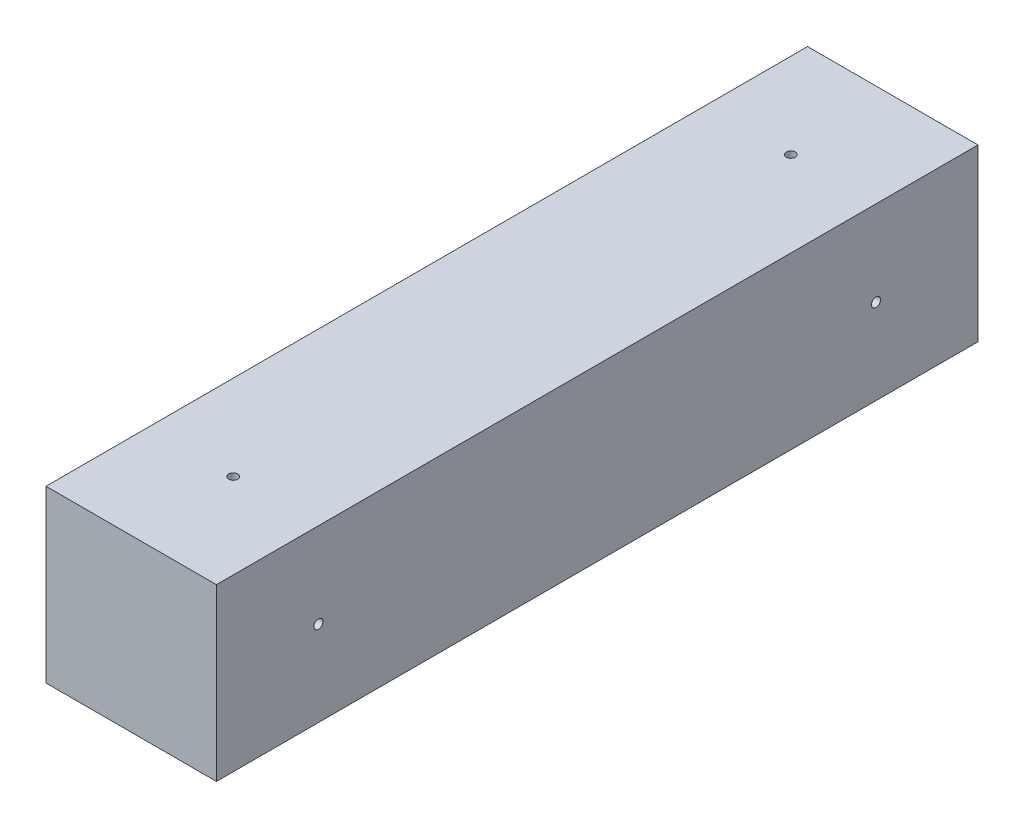
ISO-10303-21;
HEADER;
FILE_DESCRIPTION(('STEP AP214'),'2;1');
FILE_NAME('part.step','',(''),(''),'','','');
FILE_SCHEMA(('AUTOMOTIVE_DESIGN { 1 0 10303 214 1 1 1 1 }'));
ENDSEC;
DATA;
#1=APPLICATION_CONTEXT('core data for automotive mechanical design processes');
#2=APPLICATION_PROTOCOL_DEFINITION('international standard','automotive_design',2000,#1);
#3=PRODUCT_CONTEXT('',#1,'mechanical');
#4=PRODUCT('Part','Part','',(#3));
#5=PRODUCT_RELATED_PRODUCT_CATEGORY('part','',(#4));
#6=PRODUCT_DEFINITION_FORMATION('','',#4);
#7=PRODUCT_DEFINITION_CONTEXT('part definition',#1,'design');
#8=PRODUCT_DEFINITION('design','',#6,#7);
#9=PRODUCT_DEFINITION_SHAPE('','',#8);
#10=(LENGTH_UNIT() NAMED_UNIT(*) SI_UNIT(.MILLI.,.METRE.));
#11=(NAMED_UNIT(*) PLANE_ANGLE_UNIT() SI_UNIT($,.RADIAN.));
#12=(NAMED_UNIT(*) SI_UNIT($,.STERADIAN.) SOLID_ANGLE_UNIT());
#13=UNCERTAINTY_MEASURE_WITH_UNIT(LENGTH_MEASURE(1.E-05),#10,'distance_accuracy_value','');
#14=(GEOMETRIC_REPRESENTATION_CONTEXT(3) GLOBAL_UNCERTAINTY_ASSIGNED_CONTEXT((#13)) GLOBAL_UNIT_ASSIGNED_CONTEXT((#10,
#11,#12)) REPRESENTATION_CONTEXT('',''));
#15=CARTESIAN_POINT('',(0.,0.,0.));
#16=DIRECTION('',(0.,0.,1.));
#17=DIRECTION('',(1.,0.,0.));
#18=AXIS2_PLACEMENT_3D('',#15,#16,#17);
#19=CARTESIAN_POINT('',(25.4,0.,83.0999999999998));
#20=DIRECTION('',(1.,0.,0.));
#21=DIRECTION('',(0.,0.,-1.));
#22=AXIS2_PLACEMENT_3D('',#19,#20,#21);
#23=CYLINDRICAL_SURFACE('',#22,1.35254999999999);
#24=CARTESIAN_POINT('',(25.4,0.,83.0999999999998));
#25=DIRECTION('',(1.,0.,0.));
#26=DIRECTION('',(0.,0.,-1.));
#27=AXIS2_PLACEMENT_3D('',#24,#25,#26);
#28=CIRCLE('',#27,1.35254999999999);
#29=CARTESIAN_POINT('',(25.4,0.,81.7474499999998));
#30=VERTEX_POINT('',#29);
#31=EDGE_CURVE('E146',#30,#30,#28,.T.);
#32=ORIENTED_EDGE('',*,*,#31,.T.);
#33=EDGE_LOOP('',(#32));
#34=FACE_BOUND('',#33,.T.);
#35=CARTESIAN_POINT('',(-2.53269627492614E-13,0.,83.099999999999));
#36=DIRECTION('',(0.707106781186547,-0.707106781186547,0.));
#37=DIRECTION('',(0.707106781186547,0.707106781186547,0.));
#38=AXIS2_PLACEMENT_3D('',#35,#36,#37);
#39=ELLIPSE('',#38,1.91279455378772,1.35254999999999);
#40=CARTESIAN_POINT('',(-2.53269627492614E-13,0.,84.452549999999));
#41=VERTEX_POINT('',#40);
#42=CARTESIAN_POINT('',(-2.53269627492614E-13,0.,81.747449999999));
#43=VERTEX_POINT('',#42);
#44=EDGE_CURVE('E46',#41,#43,#39,.F.);
#45=ORIENTED_EDGE('',*,*,#44,.T.);
#46=CARTESIAN_POINT('',(-2.53269627492614E-13,0.,83.099999999999));
#47=DIRECTION('',(0.707106781186547,0.707106781186547,0.));
#48=DIRECTION('',(0.707106781186547,-0.707106781186547,0.));
#49=AXIS2_PLACEMENT_3D('',#46,#47,#48);
#50=ELLIPSE('',#49,1.91279455378772,1.35254999999999);
#51=EDGE_CURVE('E11',#43,#41,#50,.F.);
#52=ORIENTED_EDGE('',*,*,#51,.T.);
#53=EDGE_LOOP('',(#45,#52));
#54=FACE_BOUND('',#53,.T.);
#55=ADVANCED_FACE('F33',(#34,#54),#23,.F.);
#56=CARTESIAN_POINT('',(25.4,0.,-83.0999999999999));
#57=DIRECTION('',(1.,0.,0.));
#58=DIRECTION('',(0.,0.,-1.));
#59=AXIS2_PLACEMENT_3D('',#56,#57,#58);
#60=CYLINDRICAL_SURFACE('',#59,1.35254999999999);
#61=CARTESIAN_POINT('',(25.4,0.,-83.0999999999999));
#62=DIRECTION('',(1.,0.,0.));
#63=DIRECTION('',(0.,0.,-1.));
#64=AXIS2_PLACEMENT_3D('',#61,#62,#63);
#65=CIRCLE('',#64,1.35254999999999);
#66=CARTESIAN_POINT('',(25.4,0.,-84.4525499999999));
#67=VERTEX_POINT('',#66);
#68=EDGE_CURVE('E140',#67,#67,#65,.T.);
#69=ORIENTED_EDGE('',*,*,#68,.T.);
#70=EDGE_LOOP('',(#69));
#71=FACE_BOUND('',#70,.T.);
#72=CARTESIAN_POINT('',(-2.53269627492614E-13,0.,-83.1000000000009));
#73=DIRECTION('',(0.707106781186547,-0.707106781186547,0.));
#74=DIRECTION('',(0.707106781186547,0.707106781186547,0.));
#75=AXIS2_PLACEMENT_3D('',#72,#73,#74);
#76=ELLIPSE('',#75,1.91279455378772,1.35254999999999);
#77=CARTESIAN_POINT('',(-2.53269627492614E-13,0.,-81.7474500000009));
#78=VERTEX_POINT('',#77);
#79=CARTESIAN_POINT('',(-2.53269627492614E-13,0.,-84.4525500000009));
#80=VERTEX_POINT('',#79);
#81=EDGE_CURVE('E53',#78,#80,#76,.F.);
#82=ORIENTED_EDGE('',*,*,#81,.T.);
#83=CARTESIAN_POINT('',(-2.53269627492614E-13,0.,-83.1000000000009));
#84=DIRECTION('',(0.707106781186547,0.707106781186547,0.));
#85=DIRECTION('',(0.707106781186547,-0.707106781186547,0.));
#86=AXIS2_PLACEMENT_3D('',#83,#84,#85);
#87=ELLIPSE('',#86,1.91279455378772,1.35254999999999);
#88=EDGE_CURVE('E94',#80,#78,#87,.F.);
#89=ORIENTED_EDGE('',*,*,#88,.T.);
#90=EDGE_LOOP('',(#82,#89));
#91=FACE_BOUND('',#90,.T.);
#92=ADVANCED_FACE('F198',(#71,#91),#60,.F.);
#93=CARTESIAN_POINT('',(-25.4,25.4,113.5));
#94=DIRECTION('',(1.,0.,0.));
#95=DIRECTION('',(0.,1.,0.));
#96=AXIS2_PLACEMENT_3D('',#93,#94,#95);
#97=PLANE('',#96);
#98=CARTESIAN_POINT('',(-25.4,0.,83.0999999999998));
#99=DIRECTION('',(1.,0.,0.));
#100=DIRECTION('',(0.,0.,-1.));
#101=AXIS2_PLACEMENT_3D('',#98,#99,#100);
#102=CIRCLE('',#101,1.35254999999999);
#103=CARTESIAN_POINT('',(-25.4,0.,81.7474499999998));
#104=VERTEX_POINT('',#103);
#105=EDGE_CURVE('E143',#104,#104,#102,.T.);
#106=ORIENTED_EDGE('',*,*,#105,.T.);
#107=EDGE_LOOP('',(#106));
#108=FACE_BOUND('',#107,.T.);
#109=CARTESIAN_POINT('',(-25.4,0.,-83.0999999999999));
#110=DIRECTION('',(1.,0.,0.));
#111=DIRECTION('',(0.,0.,-1.));
#112=AXIS2_PLACEMENT_3D('',#109,#110,#111);
#113=CIRCLE('',#112,1.35254999999999);
#114=CARTESIAN_POINT('',(-25.4,0.,-84.4525499999999));
#115=VERTEX_POINT('',#114);
#116=EDGE_CURVE('E130',#115,#115,#113,.T.);
#117=ORIENTED_EDGE('',*,*,#116,.T.);
#118=EDGE_LOOP('',(#117));
#119=FACE_BOUND('',#118,.T.);
#120=DIRECTION('',(0.,-1.,0.));
#121=VECTOR('',#120,1.);
#122=CARTESIAN_POINT('',(-25.4,25.4,-113.5));
#123=LINE('',#122,#121);
#124=CARTESIAN_POINT('',(-25.4,25.4,-113.5));
#125=VERTEX_POINT('',#124);
#126=CARTESIAN_POINT('',(-25.4,-25.4,-113.5));
#127=VERTEX_POINT('',#126);
#128=EDGE_CURVE('E127',#125,#127,#123,.T.);
#129=ORIENTED_EDGE('',*,*,#128,.T.);
#130=DIRECTION('',(0.,0.,-1.));
#131=VECTOR('',#130,1.);
#132=CARTESIAN_POINT('',(-25.4,-25.4,113.5));
#133=LINE('',#132,#131);
#134=CARTESIAN_POINT('',(-25.4,-25.4,113.5));
#135=VERTEX_POINT('',#134);
#136=EDGE_CURVE('E107',#135,#127,#133,.T.);
#137=ORIENTED_EDGE('',*,*,#136,.F.);
#138=DIRECTION('',(0.,-1.,0.));
#139=VECTOR('',#138,1.);
#140=CARTESIAN_POINT('',(-25.4,25.4,113.5));
#141=LINE('',#140,#139);
#142=CARTESIAN_POINT('',(-25.4,25.4,113.5));
#143=VERTEX_POINT('',#142);
#144=EDGE_CURVE('E122',#143,#135,#141,.T.);
#145=ORIENTED_EDGE('',*,*,#144,.F.);
#146=DIRECTION('',(0.,0.,-1.));
#147=VECTOR('',#146,1.);
#148=CARTESIAN_POINT('',(-25.4,25.4,113.5));
#149=LINE('',#148,#147);
#150=EDGE_CURVE('E116',#143,#125,#149,.T.);
#151=ORIENTED_EDGE('',*,*,#150,.T.);
#152=EDGE_LOOP('',(#129,#137,#145,#151));
#153=FACE_BOUND('',#152,.T.);
#154=ADVANCED_FACE('F35',(#108,#119,#153),#97,.F.);
#155=CARTESIAN_POINT('',(-25.4,-25.4,113.5));
#156=DIRECTION('',(0.,1.,0.));
#157=DIRECTION('',(0.,0.,1.));
#158=AXIS2_PLACEMENT_3D('',#155,#156,#157);
#159=PLANE('',#158);
#160=CARTESIAN_POINT('',(-2.53269627492614E-13,-25.4,83.0999999999981));
#161=DIRECTION('',(0.,1.,0.));
#162=DIRECTION('',(0.,0.,1.));
#163=AXIS2_PLACEMENT_3D('',#160,#161,#162);
#164=CIRCLE('',#163,1.35254999999999);
#165=CARTESIAN_POINT('',(-2.53269627492614E-13,-25.4,84.4525499999981));
#166=VERTEX_POINT('',#165);
#167=EDGE_CURVE('E155',#166,#166,#164,.T.);
#168=ORIENTED_EDGE('',*,*,#167,.T.);
#169=EDGE_LOOP('',(#168));
#170=FACE_BOUND('',#169,.T.);
#171=CARTESIAN_POINT('',(-2.53269627492614E-13,-25.4,-83.1000000000019));
#172=DIRECTION('',(0.,1.,0.));
#173=DIRECTION('',(0.,0.,1.));
#174=AXIS2_PLACEMENT_3D('',#171,#172,#173);
#175=CIRCLE('',#174,1.35254999999999);
#176=CARTESIAN_POINT('',(-2.53269627492614E-13,-25.4,-81.7474500000019));
#177=VERTEX_POINT('',#176);
#178=EDGE_CURVE('E149',#177,#177,#175,.T.);
#179=ORIENTED_EDGE('',*,*,#178,.T.);
#180=EDGE_LOOP('',(#179));
#181=FACE_BOUND('',#180,.T.);
#182=DIRECTION('',(1.,0.,0.));
#183=VECTOR('',#182,1.);
#184=CARTESIAN_POINT('',(-25.4,-25.4,-113.5));
#185=LINE('',#184,#183);
#186=CARTESIAN_POINT('',(25.4,-25.4,-113.5));
#187=VERTEX_POINT('',#186);
#188=EDGE_CURVE('E125',#127,#187,#185,.T.);
#189=ORIENTED_EDGE('',*,*,#188,.T.);
#190=DIRECTION('',(0.,0.,-1.));
#191=VECTOR('',#190,1.);
#192=CARTESIAN_POINT('',(25.4,-25.4,113.5));
#193=LINE('',#192,#191);
#194=CARTESIAN_POINT('',(25.4,-25.4,113.5));
#195=VERTEX_POINT('',#194);
#196=EDGE_CURVE('E110',#195,#187,#193,.T.);
#197=ORIENTED_EDGE('',*,*,#196,.F.);
#198=DIRECTION('',(1.,0.,0.));
#199=VECTOR('',#198,1.);
#200=CARTESIAN_POINT('',(-25.4,-25.4,113.5));
#201=LINE('',#200,#199);
#202=EDGE_CURVE('E134',#135,#195,#201,.T.);
#203=ORIENTED_EDGE('',*,*,#202,.F.);
#204=ORIENTED_EDGE('',*,*,#136,.T.);
#205=EDGE_LOOP('',(#189,#197,#203,#204));
#206=FACE_BOUND('',#205,.T.);
#207=ADVANCED_FACE('F184',(#170,#181,#206),#159,.F.);
#208=CARTESIAN_POINT('',(25.4,25.4,113.5));
#209=DIRECTION('',(-1.,0.,0.));
#210=DIRECTION('',(0.,-1.,0.));
#211=AXIS2_PLACEMENT_3D('',#208,#209,#210);
#212=PLANE('',#211);
#213=ORIENTED_EDGE('',*,*,#31,.F.);
#214=EDGE_LOOP('',(#213));
#215=FACE_BOUND('',#214,.T.);
#216=ORIENTED_EDGE('',*,*,#68,.F.);
#217=EDGE_LOOP('',(#216));
#218=FACE_BOUND('',#217,.T.);
#219=DIRECTION('',(0.,1.,0.));
#220=VECTOR('',#219,1.);
#221=CARTESIAN_POINT('',(25.4,25.4,-113.5));
#222=LINE('',#221,#220);
#223=CARTESIAN_POINT('',(25.4,25.4,-113.5));
#224=VERTEX_POINT('',#223);
#225=EDGE_CURVE('E123',#187,#224,#222,.T.);
#226=ORIENTED_EDGE('',*,*,#225,.T.);
#227=DIRECTION('',(0.,0.,-1.));
#228=VECTOR('',#227,1.);
#229=CARTESIAN_POINT('',(25.4,25.4,113.5));
#230=LINE('',#229,#228);
#231=CARTESIAN_POINT('',(25.4,25.4,113.5));
#232=VERTEX_POINT('',#231);
#233=EDGE_CURVE('E113',#232,#224,#230,.T.);
#234=ORIENTED_EDGE('',*,*,#233,.F.);
#235=DIRECTION('',(0.,1.,0.));
#236=VECTOR('',#235,1.);
#237=CARTESIAN_POINT('',(25.4,25.4,113.5));
#238=LINE('',#237,#236);
#239=EDGE_CURVE('E132',#195,#232,#238,.T.);
#240=ORIENTED_EDGE('',*,*,#239,.F.);
#241=ORIENTED_EDGE('',*,*,#196,.T.);
#242=EDGE_LOOP('',(#226,#234,#240,#241));
#243=FACE_BOUND('',#242,.T.);
#244=ADVANCED_FACE('F167',(#215,#218,#243),#212,.F.);
#245=CARTESIAN_POINT('',(-25.4,25.4,113.5));
#246=DIRECTION('',(0.,-1.,0.));
#247=DIRECTION('',(0.,0.,-1.));
#248=AXIS2_PLACEMENT_3D('',#245,#246,#247);
#249=PLANE('',#248);
#250=CARTESIAN_POINT('',(-2.53269627492614E-13,25.4,83.0999999999981));
#251=DIRECTION('',(0.,1.,0.));
#252=DIRECTION('',(0.,0.,1.));
#253=AXIS2_PLACEMENT_3D('',#250,#251,#252);
#254=CIRCLE('',#253,1.35255);
#255=CARTESIAN_POINT('',(-2.53269627492614E-13,25.4,84.4525499999981));
#256=VERTEX_POINT('',#255);
#257=EDGE_CURVE('E158',#256,#256,#254,.T.);
#258=ORIENTED_EDGE('',*,*,#257,.F.);
#259=EDGE_LOOP('',(#258));
#260=FACE_BOUND('',#259,.T.);
#261=CARTESIAN_POINT('',(-2.53269627492614E-13,25.4,-83.1000000000019));
#262=DIRECTION('',(0.,1.,0.));
#263=DIRECTION('',(0.,0.,1.));
#264=AXIS2_PLACEMENT_3D('',#261,#262,#263);
#265=CIRCLE('',#264,1.35255);
#266=CARTESIAN_POINT('',(-2.53269627492614E-13,25.4,-81.7474500000019));
#267=VERTEX_POINT('',#266);
#268=EDGE_CURVE('E152',#267,#267,#265,.T.);
#269=ORIENTED_EDGE('',*,*,#268,.F.);
#270=EDGE_LOOP('',(#269));
#271=FACE_BOUND('',#270,.T.);
#272=DIRECTION('',(-1.,0.,0.));
#273=VECTOR('',#272,1.);
#274=CARTESIAN_POINT('',(-25.4,25.4,-113.5));
#275=LINE('',#274,#273);
#276=EDGE_CURVE('E120',#224,#125,#275,.T.);
#277=ORIENTED_EDGE('',*,*,#276,.T.);
#278=ORIENTED_EDGE('',*,*,#150,.F.);
#279=DIRECTION('',(-1.,0.,0.));
#280=VECTOR('',#279,1.);
#281=CARTESIAN_POINT('',(-25.4,25.4,113.5));
#282=LINE('',#281,#280);
#283=EDGE_CURVE('E119',#232,#143,#282,.T.);
#284=ORIENTED_EDGE('',*,*,#283,.F.);
#285=ORIENTED_EDGE('',*,*,#233,.T.);
#286=EDGE_LOOP('',(#277,#278,#284,#285));
#287=FACE_BOUND('',#286,.T.);
#288=ADVANCED_FACE('F163',(#260,#271,#287),#249,.F.);
#289=CARTESIAN_POINT('',(0.,0.,113.5));
#290=DIRECTION('',(0.,0.,1.));
#291=DIRECTION('',(1.,0.,0.));
#292=AXIS2_PLACEMENT_3D('',#289,#290,#291);
#293=PLANE('',#292);
#294=ORIENTED_EDGE('',*,*,#144,.T.);
#295=ORIENTED_EDGE('',*,*,#202,.T.);
#296=ORIENTED_EDGE('',*,*,#239,.T.);
#297=ORIENTED_EDGE('',*,*,#283,.T.);
#298=EDGE_LOOP('',(#294,#295,#296,#297));
#299=FACE_BOUND('',#298,.T.);
#300=ADVANCED_FACE('F166',(#299),#293,.T.);
#301=CARTESIAN_POINT('',(0.,0.,-113.5));
#302=DIRECTION('',(0.,0.,1.));
#303=DIRECTION('',(1.,0.,0.));
#304=AXIS2_PLACEMENT_3D('',#301,#302,#303);
#305=PLANE('',#304);
#306=ORIENTED_EDGE('',*,*,#128,.F.);
#307=ORIENTED_EDGE('',*,*,#276,.F.);
#308=ORIENTED_EDGE('',*,*,#225,.F.);
#309=ORIENTED_EDGE('',*,*,#188,.F.);
#310=EDGE_LOOP('',(#306,#307,#308,#309));
#311=FACE_BOUND('',#310,.T.);
#312=ADVANCED_FACE('F181',(#311),#305,.F.);
#313=CARTESIAN_POINT('',(-2.53269627492614E-13,0.,-83.1000000000009));
#314=DIRECTION('',(0.707106781186547,-0.707106781186547,0.));
#315=DIRECTION('',(0.707106781186547,0.707106781186547,0.));
#316=AXIS2_PLACEMENT_3D('',#313,#314,#315);
#317=ELLIPSE('',#316,1.91279455378772,1.35254999999999);
#318=EDGE_CURVE('E103',#78,#80,#317,.T.);
#319=ORIENTED_EDGE('',*,*,#318,.T.);
#320=CARTESIAN_POINT('',(-2.53269627492614E-13,0.,-83.1000000000009));
#321=DIRECTION('',(0.707106781186547,0.707106781186547,0.));
#322=DIRECTION('',(0.707106781186547,-0.707106781186547,0.));
#323=AXIS2_PLACEMENT_3D('',#320,#321,#322);
#324=ELLIPSE('',#323,1.91279455378772,1.35254999999999);
#325=EDGE_CURVE('E100',#80,#78,#324,.T.);
#326=ORIENTED_EDGE('',*,*,#325,.T.);
#327=EDGE_LOOP('',(#319,#326));
#328=FACE_BOUND('',#327,.T.);
#329=ORIENTED_EDGE('',*,*,#116,.F.);
#330=EDGE_LOOP('',(#329));
#331=FACE_BOUND('',#330,.T.);
#332=ADVANCED_FACE('F206',(#328,#331),#60,.F.);
#333=CARTESIAN_POINT('',(-2.53269627492614E-13,0.,83.099999999999));
#334=DIRECTION('',(0.707106781186547,-0.707106781186547,0.));
#335=DIRECTION('',(0.707106781186547,0.707106781186547,0.));
#336=AXIS2_PLACEMENT_3D('',#333,#334,#335);
#337=ELLIPSE('',#336,1.91279455378772,1.35254999999999);
#338=EDGE_CURVE('E87',#41,#43,#337,.T.);
#339=ORIENTED_EDGE('',*,*,#338,.T.);
#340=CARTESIAN_POINT('',(-2.53269627492614E-13,0.,83.099999999999));
#341=DIRECTION('',(0.707106781186547,0.707106781186547,0.));
#342=DIRECTION('',(0.707106781186547,-0.707106781186547,0.));
#343=AXIS2_PLACEMENT_3D('',#340,#341,#342);
#344=ELLIPSE('',#343,1.91279455378772,1.35254999999999);
#345=EDGE_CURVE('E41',#43,#41,#344,.T.);
#346=ORIENTED_EDGE('',*,*,#345,.T.);
#347=EDGE_LOOP('',(#339,#346));
#348=FACE_BOUND('',#347,.T.);
#349=ORIENTED_EDGE('',*,*,#105,.F.);
#350=EDGE_LOOP('',(#349));
#351=FACE_BOUND('',#350,.T.);
#352=ADVANCED_FACE('F96',(#348,#351),#23,.F.);
#353=CARTESIAN_POINT('',(-2.53269627492614E-13,25.4,-83.1000000000019));
#354=DIRECTION('',(0.,1.,0.));
#355=DIRECTION('',(0.,0.,1.));
#356=AXIS2_PLACEMENT_3D('',#353,#354,#355);
#357=CYLINDRICAL_SURFACE('',#356,1.35255);
#358=ORIENTED_EDGE('',*,*,#268,.T.);
#359=EDGE_LOOP('',(#358));
#360=FACE_BOUND('',#359,.T.);
#361=ORIENTED_EDGE('',*,*,#81,.F.);
#362=ORIENTED_EDGE('',*,*,#325,.F.);
#363=EDGE_LOOP('',(#361,#362));
#364=FACE_BOUND('',#363,.T.);
#365=ADVANCED_FACE('F209',(#360,#364),#357,.F.);
#366=ORIENTED_EDGE('',*,*,#178,.F.);
#367=EDGE_LOOP('',(#366));
#368=FACE_BOUND('',#367,.T.);
#369=ORIENTED_EDGE('',*,*,#318,.F.);
#370=ORIENTED_EDGE('',*,*,#88,.F.);
#371=EDGE_LOOP('',(#369,#370));
#372=FACE_BOUND('',#371,.T.);
#373=ADVANCED_FACE('F214',(#368,#372),#357,.F.);
#374=CARTESIAN_POINT('',(-2.53269627492614E-13,25.4,83.0999999999981));
#375=DIRECTION('',(0.,1.,0.));
#376=DIRECTION('',(0.,0.,1.));
#377=AXIS2_PLACEMENT_3D('',#374,#375,#376);
#378=CYLINDRICAL_SURFACE('',#377,1.35255);
#379=ORIENTED_EDGE('',*,*,#257,.T.);
#380=EDGE_LOOP('',(#379));
#381=FACE_BOUND('',#380,.T.);
#382=ORIENTED_EDGE('',*,*,#44,.F.);
#383=ORIENTED_EDGE('',*,*,#345,.F.);
#384=EDGE_LOOP('',(#382,#383));
#385=FACE_BOUND('',#384,.T.);
#386=ADVANCED_FACE('F93',(#381,#385),#378,.F.);
#387=ORIENTED_EDGE('',*,*,#167,.F.);
#388=EDGE_LOOP('',(#387));
#389=FACE_BOUND('',#388,.T.);
#390=ORIENTED_EDGE('',*,*,#338,.F.);
#391=ORIENTED_EDGE('',*,*,#51,.F.);
#392=EDGE_LOOP('',(#390,#391));
#393=FACE_BOUND('',#392,.T.);
#394=ADVANCED_FACE('F88',(#389,#393),#378,.F.);
#395=CLOSED_SHELL('',(#55,#92,#154,#207,#244,#288,#300,#312,#332,#352,#365,#373,#386,#394));
#396=MANIFOLD_SOLID_BREP('B2',#395);
#397=ADVANCED_BREP_SHAPE_REPRESENTATION('',(#18,#396),#14);
#398=SHAPE_DEFINITION_REPRESENTATION(#9,#397);
ENDSEC;
END-ISO-10303-21;
